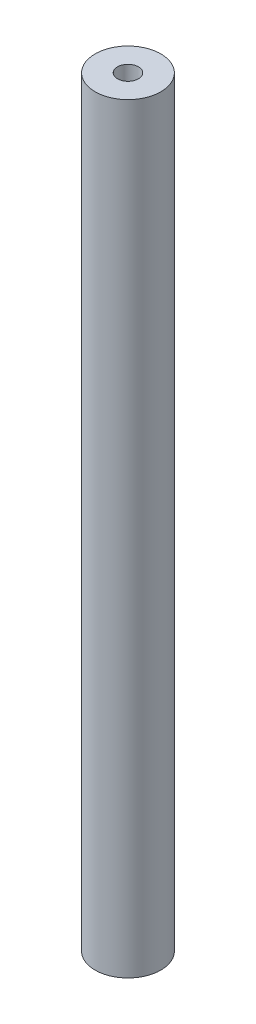
ISO-10303-21;
HEADER;
FILE_DESCRIPTION(('STEP AP214'),'2;1');
FILE_NAME('part.step','',(''),(''),'','','');
FILE_SCHEMA(('AUTOMOTIVE_DESIGN { 1 0 10303 214 1 1 1 1 }'));
ENDSEC;
DATA;
#1=APPLICATION_CONTEXT('core data for automotive mechanical design processes');
#2=APPLICATION_PROTOCOL_DEFINITION('international standard','automotive_design',2000,#1);
#3=PRODUCT_CONTEXT('',#1,'mechanical');
#4=PRODUCT('Part','Part','',(#3));
#5=PRODUCT_RELATED_PRODUCT_CATEGORY('part','',(#4));
#6=PRODUCT_DEFINITION_FORMATION('','',#4);
#7=PRODUCT_DEFINITION_CONTEXT('part definition',#1,'design');
#8=PRODUCT_DEFINITION('design','',#6,#7);
#9=PRODUCT_DEFINITION_SHAPE('','',#8);
#10=(LENGTH_UNIT() NAMED_UNIT(*) SI_UNIT(.MILLI.,.METRE.));
#11=(NAMED_UNIT(*) PLANE_ANGLE_UNIT() SI_UNIT($,.RADIAN.));
#12=(NAMED_UNIT(*) SI_UNIT($,.STERADIAN.) SOLID_ANGLE_UNIT());
#13=UNCERTAINTY_MEASURE_WITH_UNIT(LENGTH_MEASURE(1.E-05),#10,'distance_accuracy_value','');
#14=(GEOMETRIC_REPRESENTATION_CONTEXT(3) GLOBAL_UNCERTAINTY_ASSIGNED_CONTEXT((#13)) GLOBAL_UNIT_ASSIGNED_CONTEXT((#10,
#11,#12)) REPRESENTATION_CONTEXT('',''));
#15=CARTESIAN_POINT('',(0.,0.,0.));
#16=DIRECTION('',(0.,0.,1.));
#17=DIRECTION('',(1.,0.,0.));
#18=AXIS2_PLACEMENT_3D('',#15,#16,#17);
#19=CARTESIAN_POINT('',(0.,73.533,0.));
#20=DIRECTION('',(0.,-1.,0.));
#21=DIRECTION('',(0.,0.,-1.));
#22=AXIS2_PLACEMENT_3D('',#19,#20,#21);
#23=CYLINDRICAL_SURFACE('',#22,6.35);
#24=CARTESIAN_POINT('',(0.,73.533,0.));
#25=DIRECTION('',(0.,1.,0.));
#26=DIRECTION('',(0.,0.,1.));
#27=AXIS2_PLACEMENT_3D('',#24,#25,#26);
#28=CIRCLE('',#27,6.35);
#29=CARTESIAN_POINT('',(0.,73.533,6.35));
#30=VERTEX_POINT('',#29);
#31=EDGE_CURVE('E11',#30,#30,#28,.T.);
#32=ORIENTED_EDGE('',*,*,#31,.F.);
#33=EDGE_LOOP('',(#32));
#34=FACE_BOUND('',#33,.T.);
#35=CARTESIAN_POINT('',(0.,-73.533,0.));
#36=DIRECTION('',(0.,1.,0.));
#37=DIRECTION('',(0.,0.,1.));
#38=AXIS2_PLACEMENT_3D('',#35,#36,#37);
#39=CIRCLE('',#38,6.35);
#40=CARTESIAN_POINT('',(0.,-73.533,6.35));
#41=VERTEX_POINT('',#40);
#42=EDGE_CURVE('E37',#41,#41,#39,.T.);
#43=ORIENTED_EDGE('',*,*,#42,.T.);
#44=EDGE_LOOP('',(#43));
#45=FACE_BOUND('',#44,.T.);
#46=ADVANCED_FACE('F34',(#34,#45),#23,.T.);
#47=CARTESIAN_POINT('',(0.,73.533,0.));
#48=DIRECTION('',(0.,1.,0.));
#49=DIRECTION('',(0.,0.,1.));
#50=AXIS2_PLACEMENT_3D('',#47,#48,#49);
#51=PLANE('',#50);
#52=CARTESIAN_POINT('',(0.,73.533,0.));
#53=DIRECTION('',(0.,1.,0.));
#54=DIRECTION('',(0.,0.,1.));
#55=AXIS2_PLACEMENT_3D('',#52,#53,#54);
#56=CIRCLE('',#55,2.01929999999999);
#57=CARTESIAN_POINT('',(0.,73.533,2.01929999999999));
#58=VERTEX_POINT('',#57);
#59=EDGE_CURVE('E57',#58,#58,#56,.T.);
#60=ORIENTED_EDGE('',*,*,#59,.F.);
#61=EDGE_LOOP('',(#60));
#62=FACE_BOUND('',#61,.T.);
#63=ORIENTED_EDGE('',*,*,#31,.T.);
#64=EDGE_LOOP('',(#63));
#65=FACE_BOUND('',#64,.T.);
#66=ADVANCED_FACE('F76',(#62,#65),#51,.T.);
#67=CARTESIAN_POINT('',(0.,-73.533,0.));
#68=DIRECTION('',(0.,1.,0.));
#69=DIRECTION('',(0.,0.,1.));
#70=AXIS2_PLACEMENT_3D('',#67,#68,#69);
#71=PLANE('',#70);
#72=CARTESIAN_POINT('',(0.,-73.533,0.));
#73=DIRECTION('',(0.,-1.,0.));
#74=DIRECTION('',(0.,0.,-1.));
#75=AXIS2_PLACEMENT_3D('',#72,#73,#74);
#76=CIRCLE('',#75,2.01929999999999);
#77=CARTESIAN_POINT('',(0.,-73.533,-2.01929999999999));
#78=VERTEX_POINT('',#77);
#79=EDGE_CURVE('E58',#78,#78,#76,.T.);
#80=ORIENTED_EDGE('',*,*,#79,.F.);
#81=EDGE_LOOP('',(#80));
#82=FACE_BOUND('',#81,.T.);
#83=ORIENTED_EDGE('',*,*,#42,.F.);
#84=EDGE_LOOP('',(#83));
#85=FACE_BOUND('',#84,.T.);
#86=ADVANCED_FACE('F73',(#82,#85),#71,.F.);
#87=CARTESIAN_POINT('',(0.,61.595,0.));
#88=DIRECTION('',(0.,1.,0.));
#89=DIRECTION('',(0.,0.,1.));
#90=AXIS2_PLACEMENT_3D('',#87,#88,#89);
#91=CONICAL_SURFACE('',#90,2.01929999999999,1.02974425867665);
#92=CARTESIAN_POINT('',(0.,60.3816821519977,0.));
#93=VERTEX_POINT('',#92);
#94=VERTEX_LOOP('',#93);
#95=FACE_BOUND('',#94,.T.);
#96=CARTESIAN_POINT('',(0.,61.595,0.));
#97=DIRECTION('',(0.,1.,0.));
#98=DIRECTION('',(0.,0.,1.));
#99=AXIS2_PLACEMENT_3D('',#96,#97,#98);
#100=CIRCLE('',#99,2.01929999999999);
#101=CARTESIAN_POINT('',(0.,61.595,2.01929999999999));
#102=VERTEX_POINT('',#101);
#103=EDGE_CURVE('E61',#102,#102,#100,.T.);
#104=ORIENTED_EDGE('',*,*,#103,.T.);
#105=EDGE_LOOP('',(#104));
#106=FACE_BOUND('',#105,.T.);
#107=ADVANCED_FACE('F75',(#95,#106),#91,.F.);
#108=CARTESIAN_POINT('',(0.,73.533,0.));
#109=DIRECTION('',(0.,1.,0.));
#110=DIRECTION('',(0.,0.,1.));
#111=AXIS2_PLACEMENT_3D('',#108,#109,#110);
#112=CYLINDRICAL_SURFACE('',#111,2.01929999999999);
#113=ORIENTED_EDGE('',*,*,#103,.F.);
#114=EDGE_LOOP('',(#113));
#115=FACE_BOUND('',#114,.T.);
#116=ORIENTED_EDGE('',*,*,#59,.T.);
#117=EDGE_LOOP('',(#116));
#118=FACE_BOUND('',#117,.T.);
#119=ADVANCED_FACE('F51',(#115,#118),#112,.F.);
#120=CARTESIAN_POINT('',(0.,-61.595,0.));
#121=DIRECTION('',(0.,-1.,0.));
#122=DIRECTION('',(0.,0.,-1.));
#123=AXIS2_PLACEMENT_3D('',#120,#121,#122);
#124=CONICAL_SURFACE('',#123,2.01929999999999,1.02974425867665);
#125=CARTESIAN_POINT('',(0.,-60.3816821519977,0.));
#126=VERTEX_POINT('',#125);
#127=VERTEX_LOOP('',#126);
#128=FACE_BOUND('',#127,.T.);
#129=CARTESIAN_POINT('',(0.,-61.595,0.));
#130=DIRECTION('',(0.,-1.,0.));
#131=DIRECTION('',(0.,0.,-1.));
#132=AXIS2_PLACEMENT_3D('',#129,#130,#131);
#133=CIRCLE('',#132,2.01929999999999);
#134=CARTESIAN_POINT('',(0.,-61.595,-2.01929999999999));
#135=VERTEX_POINT('',#134);
#136=EDGE_CURVE('E55',#135,#135,#133,.T.);
#137=ORIENTED_EDGE('',*,*,#136,.T.);
#138=EDGE_LOOP('',(#137));
#139=FACE_BOUND('',#138,.T.);
#140=ADVANCED_FACE('F47',(#128,#139),#124,.F.);
#141=CARTESIAN_POINT('',(0.,-73.533,0.));
#142=DIRECTION('',(0.,-1.,0.));
#143=DIRECTION('',(0.,0.,-1.));
#144=AXIS2_PLACEMENT_3D('',#141,#142,#143);
#145=CYLINDRICAL_SURFACE('',#144,2.01929999999999);
#146=ORIENTED_EDGE('',*,*,#136,.F.);
#147=EDGE_LOOP('',(#146));
#148=FACE_BOUND('',#147,.T.);
#149=ORIENTED_EDGE('',*,*,#79,.T.);
#150=EDGE_LOOP('',(#149));
#151=FACE_BOUND('',#150,.T.);
#152=ADVANCED_FACE('F50',(#148,#151),#145,.F.);
#153=CLOSED_SHELL('',(#46,#66,#86,#107,#119,#140,#152));
#154=MANIFOLD_SOLID_BREP('B2',#153);
#155=ADVANCED_BREP_SHAPE_REPRESENTATION('',(#18,#154),#14);
#156=SHAPE_DEFINITION_REPRESENTATION(#9,#155);
ENDSEC;
END-ISO-10303-21;
